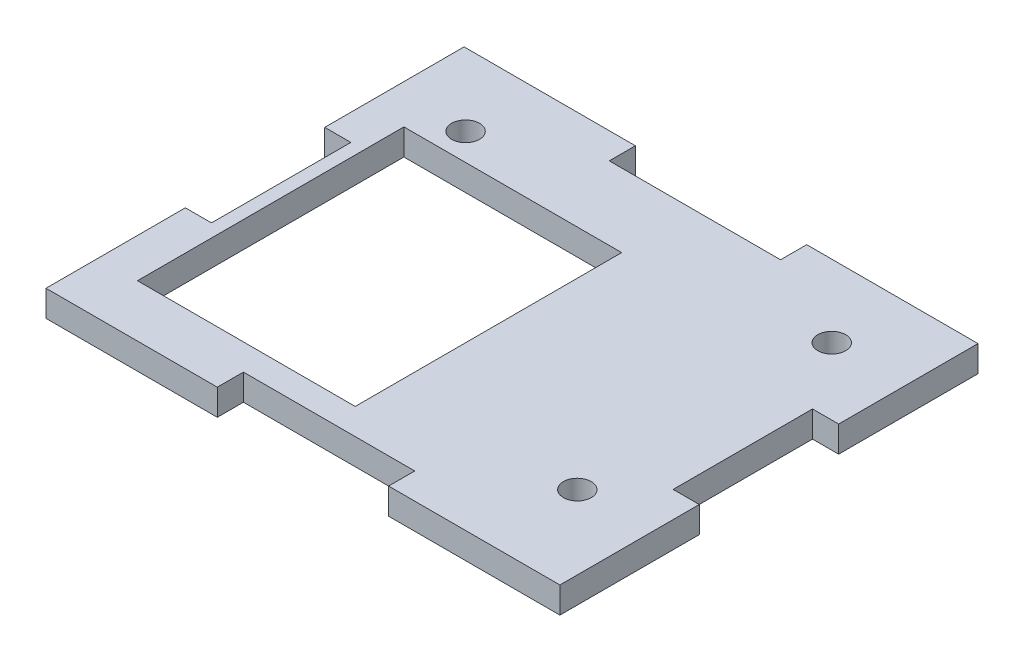
ISO-10303-21;
HEADER;
FILE_DESCRIPTION(('STEP AP214'),'2;1');
FILE_NAME('part.step','',(''),(''),'','','');
FILE_SCHEMA(('AUTOMOTIVE_DESIGN { 1 0 10303 214 1 1 1 1 }'));
ENDSEC;
DATA;
#1=APPLICATION_CONTEXT('core data for automotive mechanical design processes');
#2=APPLICATION_PROTOCOL_DEFINITION('international standard','automotive_design',2000,#1);
#3=PRODUCT_CONTEXT('',#1,'mechanical');
#4=PRODUCT('Part','Part','',(#3));
#5=PRODUCT_RELATED_PRODUCT_CATEGORY('part','',(#4));
#6=PRODUCT_DEFINITION_FORMATION('','',#4);
#7=PRODUCT_DEFINITION_CONTEXT('part definition',#1,'design');
#8=PRODUCT_DEFINITION('design','',#6,#7);
#9=PRODUCT_DEFINITION_SHAPE('','',#8);
#10=(LENGTH_UNIT() NAMED_UNIT(*) SI_UNIT(.MILLI.,.METRE.));
#11=(NAMED_UNIT(*) PLANE_ANGLE_UNIT() SI_UNIT($,.RADIAN.));
#12=(NAMED_UNIT(*) SI_UNIT($,.STERADIAN.) SOLID_ANGLE_UNIT());
#13=UNCERTAINTY_MEASURE_WITH_UNIT(LENGTH_MEASURE(1.E-05),#10,'distance_accuracy_value','');
#14=(GEOMETRIC_REPRESENTATION_CONTEXT(3) GLOBAL_UNCERTAINTY_ASSIGNED_CONTEXT((#13)) GLOBAL_UNIT_ASSIGNED_CONTEXT((#10,
#11,#12)) REPRESENTATION_CONTEXT('',''));
#15=CARTESIAN_POINT('',(0.,0.,0.));
#16=DIRECTION('',(0.,0.,1.));
#17=DIRECTION('',(1.,0.,0.));
#18=AXIS2_PLACEMENT_3D('',#15,#16,#17);
#19=CARTESIAN_POINT('',(0.,3.,0.));
#20=DIRECTION('',(0.,1.,0.));
#21=DIRECTION('',(0.,0.,1.));
#22=AXIS2_PLACEMENT_3D('',#19,#20,#21);
#23=PLANE('',#22);
#24=DIRECTION('',(0.,0.,-1.));
#25=VECTOR('',#24,1.);
#26=CARTESIAN_POINT('',(0.,3.,18.));
#27=LINE('',#26,#25);
#28=CARTESIAN_POINT('',(0.,3.,18.));
#29=VERTEX_POINT('',#28);
#30=CARTESIAN_POINT('',(0.,3.,-12.59));
#31=VERTEX_POINT('',#30);
#32=EDGE_CURVE('E48',#29,#31,#27,.T.);
#33=ORIENTED_EDGE('',*,*,#32,.F.);
#34=DIRECTION('',(1.,0.,0.));
#35=VECTOR('',#34,1.);
#36=CARTESIAN_POINT('',(-25.,3.,18.));
#37=LINE('',#36,#35);
#38=CARTESIAN_POINT('',(-25.,3.,18.));
#39=VERTEX_POINT('',#38);
#40=EDGE_CURVE('E212',#39,#29,#37,.T.);
#41=ORIENTED_EDGE('',*,*,#40,.F.);
#42=DIRECTION('',(0.,0.,1.));
#43=VECTOR('',#42,1.);
#44=CARTESIAN_POINT('',(-25.,3.,18.));
#45=LINE('',#44,#43);
#46=CARTESIAN_POINT('',(-25.,3.,-12.59));
#47=VERTEX_POINT('',#46);
#48=EDGE_CURVE('E215',#47,#39,#45,.T.);
#49=ORIENTED_EDGE('',*,*,#48,.F.);
#50=DIRECTION('',(-1.,0.,0.));
#51=VECTOR('',#50,1.);
#52=CARTESIAN_POINT('',(-25.,3.,-12.59));
#53=LINE('',#52,#51);
#54=EDGE_CURVE('E221',#31,#47,#53,.T.);
#55=ORIENTED_EDGE('',*,*,#54,.F.);
#56=EDGE_LOOP('',(#33,#41,#49,#55));
#57=FACE_BOUND('',#56,.T.);
#58=CARTESIAN_POINT('',(21.0185,3.,-15.69));
#59=DIRECTION('',(0.,1.,0.));
#60=DIRECTION('',(0.,0.,1.));
#61=AXIS2_PLACEMENT_3D('',#58,#59,#60);
#62=CIRCLE('',#61,1.6);
#63=CARTESIAN_POINT('',(21.0185,3.,-14.09));
#64=VERTEX_POINT('',#63);
#65=EDGE_CURVE('E237',#64,#64,#62,.T.);
#66=ORIENTED_EDGE('',*,*,#65,.F.);
#67=EDGE_LOOP('',(#66));
#68=FACE_BOUND('',#67,.T.);
#69=DIRECTION('',(-1.,0.,0.));
#70=VECTOR('',#69,1.);
#71=CARTESIAN_POINT('',(-9.83333333333333,3.,-24.));
#72=LINE('',#71,#70);
#73=CARTESIAN_POINT('',(-9.83333333333333,3.,-24.));
#74=VERTEX_POINT('',#73);
#75=CARTESIAN_POINT('',(-29.5,3.,-24.));
#76=VERTEX_POINT('',#75);
#77=EDGE_CURVE('E249',#74,#76,#72,.T.);
#78=ORIENTED_EDGE('',*,*,#77,.T.);
#79=DIRECTION('',(0.,0.,1.));
#80=VECTOR('',#79,1.);
#81=CARTESIAN_POINT('',(-29.5,3.,-24.));
#82=LINE('',#81,#80);
#83=CARTESIAN_POINT('',(-29.5,3.,-8.));
#84=VERTEX_POINT('',#83);
#85=EDGE_CURVE('E252',#76,#84,#82,.T.);
#86=ORIENTED_EDGE('',*,*,#85,.T.);
#87=DIRECTION('',(1.,0.,0.));
#88=VECTOR('',#87,1.);
#89=CARTESIAN_POINT('',(-29.5,3.,-8.));
#90=LINE('',#89,#88);
#91=CARTESIAN_POINT('',(-26.5,3.,-8.));
#92=VERTEX_POINT('',#91);
#93=EDGE_CURVE('E255',#84,#92,#90,.T.);
#94=ORIENTED_EDGE('',*,*,#93,.T.);
#95=DIRECTION('',(0.,0.,1.));
#96=VECTOR('',#95,1.);
#97=CARTESIAN_POINT('',(-26.5,3.,-8.));
#98=LINE('',#97,#96);
#99=CARTESIAN_POINT('',(-26.5,3.,8.));
#100=VERTEX_POINT('',#99);
#101=EDGE_CURVE('E257',#92,#100,#98,.T.);
#102=ORIENTED_EDGE('',*,*,#101,.T.);
#103=DIRECTION('',(-1.,0.,0.));
#104=VECTOR('',#103,1.);
#105=CARTESIAN_POINT('',(-26.5,3.,8.));
#106=LINE('',#105,#104);
#107=CARTESIAN_POINT('',(-29.5,3.,8.));
#108=VERTEX_POINT('',#107);
#109=EDGE_CURVE('E259',#100,#108,#106,.T.);
#110=ORIENTED_EDGE('',*,*,#109,.T.);
#111=DIRECTION('',(0.,0.,1.));
#112=VECTOR('',#111,1.);
#113=CARTESIAN_POINT('',(-29.5,3.,8.));
#114=LINE('',#113,#112);
#115=CARTESIAN_POINT('',(-29.5,3.,24.));
#116=VERTEX_POINT('',#115);
#117=EDGE_CURVE('E261',#108,#116,#114,.T.);
#118=ORIENTED_EDGE('',*,*,#117,.T.);
#119=DIRECTION('',(1.,0.,0.));
#120=VECTOR('',#119,1.);
#121=CARTESIAN_POINT('',(-29.5,3.,24.));
#122=LINE('',#121,#120);
#123=CARTESIAN_POINT('',(-9.83333333333333,3.,24.));
#124=VERTEX_POINT('',#123);
#125=EDGE_CURVE('E263',#116,#124,#122,.T.);
#126=ORIENTED_EDGE('',*,*,#125,.T.);
#127=DIRECTION('',(0.,0.,-1.));
#128=VECTOR('',#127,1.);
#129=CARTESIAN_POINT('',(-9.83333333333333,3.,24.));
#130=LINE('',#129,#128);
#131=CARTESIAN_POINT('',(-9.83333333333333,3.,21.));
#132=VERTEX_POINT('',#131);
#133=EDGE_CURVE('E265',#124,#132,#130,.T.);
#134=ORIENTED_EDGE('',*,*,#133,.T.);
#135=DIRECTION('',(1.,0.,0.));
#136=VECTOR('',#135,1.);
#137=CARTESIAN_POINT('',(-9.83333333333333,3.,21.));
#138=LINE('',#137,#136);
#139=CARTESIAN_POINT('',(9.83333333333333,3.,21.));
#140=VERTEX_POINT('',#139);
#141=EDGE_CURVE('E267',#132,#140,#138,.T.);
#142=ORIENTED_EDGE('',*,*,#141,.T.);
#143=DIRECTION('',(0.,0.,1.));
#144=VECTOR('',#143,1.);
#145=CARTESIAN_POINT('',(9.83333333333333,3.,21.));
#146=LINE('',#145,#144);
#147=CARTESIAN_POINT('',(9.83333333333333,3.,24.));
#148=VERTEX_POINT('',#147);
#149=EDGE_CURVE('E269',#140,#148,#146,.T.);
#150=ORIENTED_EDGE('',*,*,#149,.T.);
#151=DIRECTION('',(1.,0.,0.));
#152=VECTOR('',#151,1.);
#153=CARTESIAN_POINT('',(9.83333333333333,3.,24.));
#154=LINE('',#153,#152);
#155=CARTESIAN_POINT('',(29.5,3.,24.));
#156=VERTEX_POINT('',#155);
#157=EDGE_CURVE('E271',#148,#156,#154,.T.);
#158=ORIENTED_EDGE('',*,*,#157,.T.);
#159=DIRECTION('',(0.,0.,-1.));
#160=VECTOR('',#159,1.);
#161=CARTESIAN_POINT('',(29.5,3.,24.));
#162=LINE('',#161,#160);
#163=CARTESIAN_POINT('',(29.5,3.,8.));
#164=VERTEX_POINT('',#163);
#165=EDGE_CURVE('E273',#156,#164,#162,.T.);
#166=ORIENTED_EDGE('',*,*,#165,.T.);
#167=DIRECTION('',(-1.,0.,0.));
#168=VECTOR('',#167,1.);
#169=CARTESIAN_POINT('',(29.5,3.,8.));
#170=LINE('',#169,#168);
#171=CARTESIAN_POINT('',(26.5,3.,8.));
#172=VERTEX_POINT('',#171);
#173=EDGE_CURVE('E275',#164,#172,#170,.T.);
#174=ORIENTED_EDGE('',*,*,#173,.T.);
#175=DIRECTION('',(0.,0.,-1.));
#176=VECTOR('',#175,1.);
#177=CARTESIAN_POINT('',(26.5,3.,8.));
#178=LINE('',#177,#176);
#179=CARTESIAN_POINT('',(26.5,3.,-7.99999999999999));
#180=VERTEX_POINT('',#179);
#181=EDGE_CURVE('E277',#172,#180,#178,.T.);
#182=ORIENTED_EDGE('',*,*,#181,.T.);
#183=DIRECTION('',(1.,0.,0.));
#184=VECTOR('',#183,1.);
#185=CARTESIAN_POINT('',(26.5,3.,-7.99999999999999));
#186=LINE('',#185,#184);
#187=CARTESIAN_POINT('',(29.5,3.,-7.99999999999999));
#188=VERTEX_POINT('',#187);
#189=EDGE_CURVE('E279',#180,#188,#186,.T.);
#190=ORIENTED_EDGE('',*,*,#189,.T.);
#191=DIRECTION('',(0.,0.,-1.));
#192=VECTOR('',#191,1.);
#193=CARTESIAN_POINT('',(29.5,3.,-7.99999999999999));
#194=LINE('',#193,#192);
#195=CARTESIAN_POINT('',(29.5,3.,-24.));
#196=VERTEX_POINT('',#195);
#197=EDGE_CURVE('E281',#188,#196,#194,.T.);
#198=ORIENTED_EDGE('',*,*,#197,.T.);
#199=DIRECTION('',(-1.,0.,0.));
#200=VECTOR('',#199,1.);
#201=CARTESIAN_POINT('',(29.5,3.,-24.));
#202=LINE('',#201,#200);
#203=CARTESIAN_POINT('',(9.83333333333334,3.,-24.));
#204=VERTEX_POINT('',#203);
#205=EDGE_CURVE('E283',#196,#204,#202,.T.);
#206=ORIENTED_EDGE('',*,*,#205,.T.);
#207=DIRECTION('',(0.,0.,1.));
#208=VECTOR('',#207,1.);
#209=CARTESIAN_POINT('',(9.83333333333334,3.,-24.));
#210=LINE('',#209,#208);
#211=CARTESIAN_POINT('',(9.83333333333334,3.,-21.));
#212=VERTEX_POINT('',#211);
#213=EDGE_CURVE('E285',#204,#212,#210,.T.);
#214=ORIENTED_EDGE('',*,*,#213,.T.);
#215=DIRECTION('',(-1.,0.,0.));
#216=VECTOR('',#215,1.);
#217=CARTESIAN_POINT('',(9.83333333333334,3.,-21.));
#218=LINE('',#217,#216);
#219=CARTESIAN_POINT('',(-9.83333333333333,3.,-21.));
#220=VERTEX_POINT('',#219);
#221=EDGE_CURVE('E287',#212,#220,#218,.T.);
#222=ORIENTED_EDGE('',*,*,#221,.T.);
#223=DIRECTION('',(0.,0.,-1.));
#224=VECTOR('',#223,1.);
#225=CARTESIAN_POINT('',(-9.83333333333333,3.,-21.));
#226=LINE('',#225,#224);
#227=EDGE_CURVE('E289',#220,#74,#226,.T.);
#228=ORIENTED_EDGE('',*,*,#227,.T.);
#229=EDGE_LOOP('',(#78,#86,#94,#102,#110,#118,#126,#134,#142,#150,#158,#166,#174,#182,#190,#198,
#206,#214,#222,#228));
#230=FACE_BOUND('',#229,.T.);
#231=CARTESIAN_POINT('',(-21.0185,3.,-15.69));
#232=DIRECTION('',(0.,1.,0.));
#233=DIRECTION('',(0.,0.,1.));
#234=AXIS2_PLACEMENT_3D('',#231,#232,#233);
#235=CIRCLE('',#234,1.6);
#236=CARTESIAN_POINT('',(-21.0185,3.,-14.09));
#237=VERTEX_POINT('',#236);
#238=EDGE_CURVE('E243',#237,#237,#235,.T.);
#239=ORIENTED_EDGE('',*,*,#238,.F.);
#240=EDGE_LOOP('',(#239));
#241=FACE_BOUND('',#240,.T.);
#242=CARTESIAN_POINT('',(21.0185,3.,13.52));
#243=DIRECTION('',(0.,1.,0.));
#244=DIRECTION('',(0.,0.,1.));
#245=AXIS2_PLACEMENT_3D('',#242,#243,#244);
#246=CIRCLE('',#245,1.6);
#247=CARTESIAN_POINT('',(21.0185,3.,15.12));
#248=VERTEX_POINT('',#247);
#249=EDGE_CURVE('E231',#248,#248,#246,.T.);
#250=ORIENTED_EDGE('',*,*,#249,.F.);
#251=EDGE_LOOP('',(#250));
#252=FACE_BOUND('',#251,.T.);
#253=ADVANCED_FACE('F33',(#57,#68,#230,#241,#252),#23,.T.);
#254=CARTESIAN_POINT('',(0.,0.,0.));
#255=DIRECTION('',(0.,1.,0.));
#256=DIRECTION('',(0.,0.,1.));
#257=AXIS2_PLACEMENT_3D('',#254,#255,#256);
#258=PLANE('',#257);
#259=DIRECTION('',(1.,0.,0.));
#260=VECTOR('',#259,1.);
#261=CARTESIAN_POINT('',(-25.,0.,18.));
#262=LINE('',#261,#260);
#263=CARTESIAN_POINT('',(-25.,0.,18.));
#264=VERTEX_POINT('',#263);
#265=CARTESIAN_POINT('',(0.,0.,18.));
#266=VERTEX_POINT('',#265);
#267=EDGE_CURVE('E202',#264,#266,#262,.T.);
#268=ORIENTED_EDGE('',*,*,#267,.T.);
#269=DIRECTION('',(0.,0.,-1.));
#270=VECTOR('',#269,1.);
#271=CARTESIAN_POINT('',(0.,0.,18.));
#272=LINE('',#271,#270);
#273=CARTESIAN_POINT('',(0.,0.,-12.59));
#274=VERTEX_POINT('',#273);
#275=EDGE_CURVE('E196',#266,#274,#272,.T.);
#276=ORIENTED_EDGE('',*,*,#275,.T.);
#277=DIRECTION('',(-1.,0.,0.));
#278=VECTOR('',#277,1.);
#279=CARTESIAN_POINT('',(-25.,0.,-12.59));
#280=LINE('',#279,#278);
#281=CARTESIAN_POINT('',(-25.,0.,-12.59));
#282=VERTEX_POINT('',#281);
#283=EDGE_CURVE('E205',#274,#282,#280,.T.);
#284=ORIENTED_EDGE('',*,*,#283,.T.);
#285=DIRECTION('',(0.,0.,1.));
#286=VECTOR('',#285,1.);
#287=CARTESIAN_POINT('',(-25.,0.,18.));
#288=LINE('',#287,#286);
#289=EDGE_CURVE('E56',#282,#264,#288,.T.);
#290=ORIENTED_EDGE('',*,*,#289,.T.);
#291=EDGE_LOOP('',(#268,#276,#284,#290));
#292=FACE_BOUND('',#291,.T.);
#293=DIRECTION('',(-1.,0.,0.));
#294=VECTOR('',#293,1.);
#295=CARTESIAN_POINT('',(-9.83333333333333,0.,-24.));
#296=LINE('',#295,#294);
#297=CARTESIAN_POINT('',(-9.83333333333333,0.,-24.));
#298=VERTEX_POINT('',#297);
#299=CARTESIAN_POINT('',(-29.5,0.,-24.));
#300=VERTEX_POINT('',#299);
#301=EDGE_CURVE('E246',#298,#300,#296,.T.);
#302=ORIENTED_EDGE('',*,*,#301,.F.);
#303=DIRECTION('',(0.,0.,-1.));
#304=VECTOR('',#303,1.);
#305=CARTESIAN_POINT('',(-9.83333333333333,0.,-21.));
#306=LINE('',#305,#304);
#307=CARTESIAN_POINT('',(-9.83333333333333,0.,-21.));
#308=VERTEX_POINT('',#307);
#309=EDGE_CURVE('E253',#308,#298,#306,.T.);
#310=ORIENTED_EDGE('',*,*,#309,.F.);
#311=DIRECTION('',(-1.,0.,0.));
#312=VECTOR('',#311,1.);
#313=CARTESIAN_POINT('',(9.83333333333334,0.,-21.));
#314=LINE('',#313,#312);
#315=CARTESIAN_POINT('',(9.83333333333334,0.,-21.));
#316=VERTEX_POINT('',#315);
#317=EDGE_CURVE('E328',#316,#308,#314,.T.);
#318=ORIENTED_EDGE('',*,*,#317,.F.);
#319=DIRECTION('',(0.,0.,1.));
#320=VECTOR('',#319,1.);
#321=CARTESIAN_POINT('',(9.83333333333334,0.,-24.));
#322=LINE('',#321,#320);
#323=CARTESIAN_POINT('',(9.83333333333334,0.,-24.));
#324=VERTEX_POINT('',#323);
#325=EDGE_CURVE('E326',#324,#316,#322,.T.);
#326=ORIENTED_EDGE('',*,*,#325,.F.);
#327=DIRECTION('',(-1.,0.,0.));
#328=VECTOR('',#327,1.);
#329=CARTESIAN_POINT('',(29.5,0.,-24.));
#330=LINE('',#329,#328);
#331=CARTESIAN_POINT('',(29.5,0.,-24.));
#332=VERTEX_POINT('',#331);
#333=EDGE_CURVE('E324',#332,#324,#330,.T.);
#334=ORIENTED_EDGE('',*,*,#333,.F.);
#335=DIRECTION('',(0.,0.,-1.));
#336=VECTOR('',#335,1.);
#337=CARTESIAN_POINT('',(29.5,0.,-7.99999999999999));
#338=LINE('',#337,#336);
#339=CARTESIAN_POINT('',(29.5,0.,-7.99999999999999));
#340=VERTEX_POINT('',#339);
#341=EDGE_CURVE('E322',#340,#332,#338,.T.);
#342=ORIENTED_EDGE('',*,*,#341,.F.);
#343=DIRECTION('',(1.,0.,0.));
#344=VECTOR('',#343,1.);
#345=CARTESIAN_POINT('',(26.5,0.,-7.99999999999999));
#346=LINE('',#345,#344);
#347=CARTESIAN_POINT('',(26.5,0.,-7.99999999999999));
#348=VERTEX_POINT('',#347);
#349=EDGE_CURVE('E320',#348,#340,#346,.T.);
#350=ORIENTED_EDGE('',*,*,#349,.F.);
#351=DIRECTION('',(0.,0.,-1.));
#352=VECTOR('',#351,1.);
#353=CARTESIAN_POINT('',(26.5,0.,8.));
#354=LINE('',#353,#352);
#355=CARTESIAN_POINT('',(26.5,0.,8.));
#356=VERTEX_POINT('',#355);
#357=EDGE_CURVE('E318',#356,#348,#354,.T.);
#358=ORIENTED_EDGE('',*,*,#357,.F.);
#359=DIRECTION('',(-1.,0.,0.));
#360=VECTOR('',#359,1.);
#361=CARTESIAN_POINT('',(29.5,0.,8.));
#362=LINE('',#361,#360);
#363=CARTESIAN_POINT('',(29.5,0.,8.));
#364=VERTEX_POINT('',#363);
#365=EDGE_CURVE('E316',#364,#356,#362,.T.);
#366=ORIENTED_EDGE('',*,*,#365,.F.);
#367=DIRECTION('',(0.,0.,-1.));
#368=VECTOR('',#367,1.);
#369=CARTESIAN_POINT('',(29.5,0.,24.));
#370=LINE('',#369,#368);
#371=CARTESIAN_POINT('',(29.5,0.,24.));
#372=VERTEX_POINT('',#371);
#373=EDGE_CURVE('E314',#372,#364,#370,.T.);
#374=ORIENTED_EDGE('',*,*,#373,.F.);
#375=DIRECTION('',(1.,0.,0.));
#376=VECTOR('',#375,1.);
#377=CARTESIAN_POINT('',(9.83333333333333,0.,24.));
#378=LINE('',#377,#376);
#379=CARTESIAN_POINT('',(9.83333333333333,0.,24.));
#380=VERTEX_POINT('',#379);
#381=EDGE_CURVE('E312',#380,#372,#378,.T.);
#382=ORIENTED_EDGE('',*,*,#381,.F.);
#383=DIRECTION('',(0.,0.,1.));
#384=VECTOR('',#383,1.);
#385=CARTESIAN_POINT('',(9.83333333333333,0.,21.));
#386=LINE('',#385,#384);
#387=CARTESIAN_POINT('',(9.83333333333333,0.,21.));
#388=VERTEX_POINT('',#387);
#389=EDGE_CURVE('E310',#388,#380,#386,.T.);
#390=ORIENTED_EDGE('',*,*,#389,.F.);
#391=DIRECTION('',(1.,0.,0.));
#392=VECTOR('',#391,1.);
#393=CARTESIAN_POINT('',(-9.83333333333333,0.,21.));
#394=LINE('',#393,#392);
#395=CARTESIAN_POINT('',(-9.83333333333333,0.,21.));
#396=VERTEX_POINT('',#395);
#397=EDGE_CURVE('E308',#396,#388,#394,.T.);
#398=ORIENTED_EDGE('',*,*,#397,.F.);
#399=DIRECTION('',(0.,0.,-1.));
#400=VECTOR('',#399,1.);
#401=CARTESIAN_POINT('',(-9.83333333333333,0.,24.));
#402=LINE('',#401,#400);
#403=CARTESIAN_POINT('',(-9.83333333333333,0.,24.));
#404=VERTEX_POINT('',#403);
#405=EDGE_CURVE('E306',#404,#396,#402,.T.);
#406=ORIENTED_EDGE('',*,*,#405,.F.);
#407=DIRECTION('',(1.,0.,0.));
#408=VECTOR('',#407,1.);
#409=CARTESIAN_POINT('',(-29.5,0.,24.));
#410=LINE('',#409,#408);
#411=CARTESIAN_POINT('',(-29.5,0.,24.));
#412=VERTEX_POINT('',#411);
#413=EDGE_CURVE('E304',#412,#404,#410,.T.);
#414=ORIENTED_EDGE('',*,*,#413,.F.);
#415=DIRECTION('',(0.,0.,1.));
#416=VECTOR('',#415,1.);
#417=CARTESIAN_POINT('',(-29.5,0.,8.));
#418=LINE('',#417,#416);
#419=CARTESIAN_POINT('',(-29.5,0.,8.));
#420=VERTEX_POINT('',#419);
#421=EDGE_CURVE('E302',#420,#412,#418,.T.);
#422=ORIENTED_EDGE('',*,*,#421,.F.);
#423=DIRECTION('',(-1.,0.,0.));
#424=VECTOR('',#423,1.);
#425=CARTESIAN_POINT('',(-26.5,0.,8.));
#426=LINE('',#425,#424);
#427=CARTESIAN_POINT('',(-26.5,0.,8.));
#428=VERTEX_POINT('',#427);
#429=EDGE_CURVE('E300',#428,#420,#426,.T.);
#430=ORIENTED_EDGE('',*,*,#429,.F.);
#431=DIRECTION('',(0.,0.,1.));
#432=VECTOR('',#431,1.);
#433=CARTESIAN_POINT('',(-26.5,0.,-8.));
#434=LINE('',#433,#432);
#435=CARTESIAN_POINT('',(-26.5,0.,-8.));
#436=VERTEX_POINT('',#435);
#437=EDGE_CURVE('E298',#436,#428,#434,.T.);
#438=ORIENTED_EDGE('',*,*,#437,.F.);
#439=DIRECTION('',(1.,0.,0.));
#440=VECTOR('',#439,1.);
#441=CARTESIAN_POINT('',(-29.5,0.,-8.));
#442=LINE('',#441,#440);
#443=CARTESIAN_POINT('',(-29.5,0.,-8.));
#444=VERTEX_POINT('',#443);
#445=EDGE_CURVE('E296',#444,#436,#442,.T.);
#446=ORIENTED_EDGE('',*,*,#445,.F.);
#447=DIRECTION('',(0.,0.,1.));
#448=VECTOR('',#447,1.);
#449=CARTESIAN_POINT('',(-29.5,0.,-24.));
#450=LINE('',#449,#448);
#451=EDGE_CURVE('E294',#300,#444,#450,.T.);
#452=ORIENTED_EDGE('',*,*,#451,.F.);
#453=EDGE_LOOP('',(#302,#310,#318,#326,#334,#342,#350,#358,#366,#374,#382,#390,#398,#406,#414,
#422,#430,#438,#446,#452));
#454=FACE_BOUND('',#453,.T.);
#455=CARTESIAN_POINT('',(-21.0185,0.,-15.69));
#456=DIRECTION('',(0.,1.,0.));
#457=DIRECTION('',(0.,0.,1.));
#458=AXIS2_PLACEMENT_3D('',#455,#456,#457);
#459=CIRCLE('',#458,1.6);
#460=CARTESIAN_POINT('',(-21.0185,0.,-14.09));
#461=VERTEX_POINT('',#460);
#462=EDGE_CURVE('E240',#461,#461,#459,.T.);
#463=ORIENTED_EDGE('',*,*,#462,.T.);
#464=EDGE_LOOP('',(#463));
#465=FACE_BOUND('',#464,.T.);
#466=CARTESIAN_POINT('',(21.0185,0.,-15.69));
#467=DIRECTION('',(0.,1.,0.));
#468=DIRECTION('',(0.,0.,1.));
#469=AXIS2_PLACEMENT_3D('',#466,#467,#468);
#470=CIRCLE('',#469,1.6);
#471=CARTESIAN_POINT('',(21.0185,0.,-14.09));
#472=VERTEX_POINT('',#471);
#473=EDGE_CURVE('E234',#472,#472,#470,.T.);
#474=ORIENTED_EDGE('',*,*,#473,.T.);
#475=EDGE_LOOP('',(#474));
#476=FACE_BOUND('',#475,.T.);
#477=CARTESIAN_POINT('',(21.0185,0.,13.52));
#478=DIRECTION('',(0.,1.,0.));
#479=DIRECTION('',(0.,0.,1.));
#480=AXIS2_PLACEMENT_3D('',#477,#478,#479);
#481=CIRCLE('',#480,1.6);
#482=CARTESIAN_POINT('',(21.0185,0.,15.12));
#483=VERTEX_POINT('',#482);
#484=EDGE_CURVE('E227',#483,#483,#481,.T.);
#485=ORIENTED_EDGE('',*,*,#484,.T.);
#486=EDGE_LOOP('',(#485));
#487=FACE_BOUND('',#486,.T.);
#488=ADVANCED_FACE('F209',(#292,#454,#465,#476,#487),#258,.F.);
#489=CARTESIAN_POINT('',(-9.83333333333333,3.,-24.));
#490=DIRECTION('',(0.,0.,1.));
#491=DIRECTION('',(1.,0.,0.));
#492=AXIS2_PLACEMENT_3D('',#489,#490,#491);
#493=PLANE('',#492);
#494=ORIENTED_EDGE('',*,*,#301,.T.);
#495=DIRECTION('',(0.,-1.,0.));
#496=VECTOR('',#495,1.);
#497=CARTESIAN_POINT('',(-29.5,3.,-24.));
#498=LINE('',#497,#496);
#499=EDGE_CURVE('E11',#76,#300,#498,.T.);
#500=ORIENTED_EDGE('',*,*,#499,.F.);
#501=ORIENTED_EDGE('',*,*,#77,.F.);
#502=DIRECTION('',(0.,-1.,0.));
#503=VECTOR('',#502,1.);
#504=CARTESIAN_POINT('',(-9.83333333333333,3.,-24.));
#505=LINE('',#504,#503);
#506=EDGE_CURVE('E291',#74,#298,#505,.T.);
#507=ORIENTED_EDGE('',*,*,#506,.T.);
#508=EDGE_LOOP('',(#494,#500,#501,#507));
#509=FACE_BOUND('',#508,.T.);
#510=ADVANCED_FACE('F35',(#509),#493,.F.);
#511=CARTESIAN_POINT('',(-29.5,3.,-24.));
#512=DIRECTION('',(1.,0.,0.));
#513=DIRECTION('',(0.,0.,-1.));
#514=AXIS2_PLACEMENT_3D('',#511,#512,#513);
#515=PLANE('',#514);
#516=ORIENTED_EDGE('',*,*,#451,.T.);
#517=DIRECTION('',(0.,-1.,0.));
#518=VECTOR('',#517,1.);
#519=CARTESIAN_POINT('',(-29.5,3.,-8.));
#520=LINE('',#519,#518);
#521=EDGE_CURVE('E41',#84,#444,#520,.T.);
#522=ORIENTED_EDGE('',*,*,#521,.F.);
#523=ORIENTED_EDGE('',*,*,#85,.F.);
#524=ORIENTED_EDGE('',*,*,#499,.T.);
#525=EDGE_LOOP('',(#516,#522,#523,#524));
#526=FACE_BOUND('',#525,.T.);
#527=ADVANCED_FACE('F410',(#526),#515,.F.);
#528=CARTESIAN_POINT('',(-29.5,3.,-8.));
#529=DIRECTION('',(0.,0.,-1.));
#530=DIRECTION('',(-1.,0.,0.));
#531=AXIS2_PLACEMENT_3D('',#528,#529,#530);
#532=PLANE('',#531);
#533=ORIENTED_EDGE('',*,*,#445,.T.);
#534=DIRECTION('',(0.,-1.,0.));
#535=VECTOR('',#534,1.);
#536=CARTESIAN_POINT('',(-26.5,3.,-8.));
#537=LINE('',#536,#535);
#538=EDGE_CURVE('E381',#92,#436,#537,.T.);
#539=ORIENTED_EDGE('',*,*,#538,.F.);
#540=ORIENTED_EDGE('',*,*,#93,.F.);
#541=ORIENTED_EDGE('',*,*,#521,.T.);
#542=EDGE_LOOP('',(#533,#539,#540,#541));
#543=FACE_BOUND('',#542,.T.);
#544=ADVANCED_FACE('F388',(#543),#532,.F.);
#545=CARTESIAN_POINT('',(-26.5,3.,-8.));
#546=DIRECTION('',(1.,0.,0.));
#547=DIRECTION('',(0.,0.,-1.));
#548=AXIS2_PLACEMENT_3D('',#545,#546,#547);
#549=PLANE('',#548);
#550=ORIENTED_EDGE('',*,*,#437,.T.);
#551=DIRECTION('',(0.,-1.,0.));
#552=VECTOR('',#551,1.);
#553=CARTESIAN_POINT('',(-26.5,3.,8.));
#554=LINE('',#553,#552);
#555=EDGE_CURVE('E378',#100,#428,#554,.T.);
#556=ORIENTED_EDGE('',*,*,#555,.F.);
#557=ORIENTED_EDGE('',*,*,#101,.F.);
#558=ORIENTED_EDGE('',*,*,#538,.T.);
#559=EDGE_LOOP('',(#550,#556,#557,#558));
#560=FACE_BOUND('',#559,.T.);
#561=ADVANCED_FACE('F398',(#560),#549,.F.);
#562=CARTESIAN_POINT('',(-26.5,3.,8.));
#563=DIRECTION('',(0.,0.,1.));
#564=DIRECTION('',(1.,0.,0.));
#565=AXIS2_PLACEMENT_3D('',#562,#563,#564);
#566=PLANE('',#565);
#567=ORIENTED_EDGE('',*,*,#429,.T.);
#568=DIRECTION('',(0.,-1.,0.));
#569=VECTOR('',#568,1.);
#570=CARTESIAN_POINT('',(-29.5,3.,8.));
#571=LINE('',#570,#569);
#572=EDGE_CURVE('E375',#108,#420,#571,.T.);
#573=ORIENTED_EDGE('',*,*,#572,.F.);
#574=ORIENTED_EDGE('',*,*,#109,.F.);
#575=ORIENTED_EDGE('',*,*,#555,.T.);
#576=EDGE_LOOP('',(#567,#573,#574,#575));
#577=FACE_BOUND('',#576,.T.);
#578=ADVANCED_FACE('F402',(#577),#566,.F.);
#579=CARTESIAN_POINT('',(-29.5,3.,8.));
#580=DIRECTION('',(1.,0.,0.));
#581=DIRECTION('',(0.,0.,-1.));
#582=AXIS2_PLACEMENT_3D('',#579,#580,#581);
#583=PLANE('',#582);
#584=ORIENTED_EDGE('',*,*,#421,.T.);
#585=DIRECTION('',(0.,-1.,0.));
#586=VECTOR('',#585,1.);
#587=CARTESIAN_POINT('',(-29.5,3.,24.));
#588=LINE('',#587,#586);
#589=EDGE_CURVE('E372',#116,#412,#588,.T.);
#590=ORIENTED_EDGE('',*,*,#589,.F.);
#591=ORIENTED_EDGE('',*,*,#117,.F.);
#592=ORIENTED_EDGE('',*,*,#572,.T.);
#593=EDGE_LOOP('',(#584,#590,#591,#592));
#594=FACE_BOUND('',#593,.T.);
#595=ADVANCED_FACE('F483',(#594),#583,.F.);
#596=CARTESIAN_POINT('',(-29.5,3.,24.));
#597=DIRECTION('',(0.,0.,-1.));
#598=DIRECTION('',(-1.,0.,0.));
#599=AXIS2_PLACEMENT_3D('',#596,#597,#598);
#600=PLANE('',#599);
#601=ORIENTED_EDGE('',*,*,#413,.T.);
#602=DIRECTION('',(0.,-1.,0.));
#603=VECTOR('',#602,1.);
#604=CARTESIAN_POINT('',(-9.83333333333333,3.,24.));
#605=LINE('',#604,#603);
#606=EDGE_CURVE('E369',#124,#404,#605,.T.);
#607=ORIENTED_EDGE('',*,*,#606,.F.);
#608=ORIENTED_EDGE('',*,*,#125,.F.);
#609=ORIENTED_EDGE('',*,*,#589,.T.);
#610=EDGE_LOOP('',(#601,#607,#608,#609));
#611=FACE_BOUND('',#610,.T.);
#612=ADVANCED_FACE('F481',(#611),#600,.F.);
#613=CARTESIAN_POINT('',(-9.83333333333333,3.,24.));
#614=DIRECTION('',(-1.,0.,0.));
#615=DIRECTION('',(0.,0.,1.));
#616=AXIS2_PLACEMENT_3D('',#613,#614,#615);
#617=PLANE('',#616);
#618=ORIENTED_EDGE('',*,*,#405,.T.);
#619=DIRECTION('',(0.,-1.,0.));
#620=VECTOR('',#619,1.);
#621=CARTESIAN_POINT('',(-9.83333333333333,3.,21.));
#622=LINE('',#621,#620);
#623=EDGE_CURVE('E366',#132,#396,#622,.T.);
#624=ORIENTED_EDGE('',*,*,#623,.F.);
#625=ORIENTED_EDGE('',*,*,#133,.F.);
#626=ORIENTED_EDGE('',*,*,#606,.T.);
#627=EDGE_LOOP('',(#618,#624,#625,#626));
#628=FACE_BOUND('',#627,.T.);
#629=ADVANCED_FACE('F476',(#628),#617,.F.);
#630=CARTESIAN_POINT('',(-9.83333333333333,3.,21.));
#631=DIRECTION('',(0.,0.,-1.));
#632=DIRECTION('',(-1.,0.,0.));
#633=AXIS2_PLACEMENT_3D('',#630,#631,#632);
#634=PLANE('',#633);
#635=ORIENTED_EDGE('',*,*,#397,.T.);
#636=DIRECTION('',(0.,-1.,0.));
#637=VECTOR('',#636,1.);
#638=CARTESIAN_POINT('',(9.83333333333333,3.,21.));
#639=LINE('',#638,#637);
#640=EDGE_CURVE('E363',#140,#388,#639,.T.);
#641=ORIENTED_EDGE('',*,*,#640,.F.);
#642=ORIENTED_EDGE('',*,*,#141,.F.);
#643=ORIENTED_EDGE('',*,*,#623,.T.);
#644=EDGE_LOOP('',(#635,#641,#642,#643));
#645=FACE_BOUND('',#644,.T.);
#646=ADVANCED_FACE('F471',(#645),#634,.F.);
#647=CARTESIAN_POINT('',(9.83333333333333,3.,21.));
#648=DIRECTION('',(1.,0.,0.));
#649=DIRECTION('',(0.,0.,-1.));
#650=AXIS2_PLACEMENT_3D('',#647,#648,#649);
#651=PLANE('',#650);
#652=ORIENTED_EDGE('',*,*,#389,.T.);
#653=DIRECTION('',(0.,-1.,0.));
#654=VECTOR('',#653,1.);
#655=CARTESIAN_POINT('',(9.83333333333333,3.,24.));
#656=LINE('',#655,#654);
#657=EDGE_CURVE('E360',#148,#380,#656,.T.);
#658=ORIENTED_EDGE('',*,*,#657,.F.);
#659=ORIENTED_EDGE('',*,*,#149,.F.);
#660=ORIENTED_EDGE('',*,*,#640,.T.);
#661=EDGE_LOOP('',(#652,#658,#659,#660));
#662=FACE_BOUND('',#661,.T.);
#663=ADVANCED_FACE('F467',(#662),#651,.F.);
#664=CARTESIAN_POINT('',(9.83333333333333,3.,24.));
#665=DIRECTION('',(0.,0.,-1.));
#666=DIRECTION('',(-1.,0.,0.));
#667=AXIS2_PLACEMENT_3D('',#664,#665,#666);
#668=PLANE('',#667);
#669=ORIENTED_EDGE('',*,*,#381,.T.);
#670=DIRECTION('',(0.,-1.,0.));
#671=VECTOR('',#670,1.);
#672=CARTESIAN_POINT('',(29.5,3.,24.));
#673=LINE('',#672,#671);
#674=EDGE_CURVE('E357',#156,#372,#673,.T.);
#675=ORIENTED_EDGE('',*,*,#674,.F.);
#676=ORIENTED_EDGE('',*,*,#157,.F.);
#677=ORIENTED_EDGE('',*,*,#657,.T.);
#678=EDGE_LOOP('',(#669,#675,#676,#677));
#679=FACE_BOUND('',#678,.T.);
#680=ADVANCED_FACE('F462',(#679),#668,.F.);
#681=CARTESIAN_POINT('',(29.5,3.,24.));
#682=DIRECTION('',(-1.,0.,0.));
#683=DIRECTION('',(0.,0.,1.));
#684=AXIS2_PLACEMENT_3D('',#681,#682,#683);
#685=PLANE('',#684);
#686=ORIENTED_EDGE('',*,*,#373,.T.);
#687=DIRECTION('',(0.,-1.,0.));
#688=VECTOR('',#687,1.);
#689=CARTESIAN_POINT('',(29.5,3.,8.));
#690=LINE('',#689,#688);
#691=EDGE_CURVE('E354',#164,#364,#690,.T.);
#692=ORIENTED_EDGE('',*,*,#691,.F.);
#693=ORIENTED_EDGE('',*,*,#165,.F.);
#694=ORIENTED_EDGE('',*,*,#674,.T.);
#695=EDGE_LOOP('',(#686,#692,#693,#694));
#696=FACE_BOUND('',#695,.T.);
#697=ADVANCED_FACE('F456',(#696),#685,.F.);
#698=CARTESIAN_POINT('',(29.5,3.,8.));
#699=DIRECTION('',(0.,0.,1.));
#700=DIRECTION('',(1.,0.,0.));
#701=AXIS2_PLACEMENT_3D('',#698,#699,#700);
#702=PLANE('',#701);
#703=ORIENTED_EDGE('',*,*,#365,.T.);
#704=DIRECTION('',(0.,-1.,0.));
#705=VECTOR('',#704,1.);
#706=CARTESIAN_POINT('',(26.5,3.,8.));
#707=LINE('',#706,#705);
#708=EDGE_CURVE('E351',#172,#356,#707,.T.);
#709=ORIENTED_EDGE('',*,*,#708,.F.);
#710=ORIENTED_EDGE('',*,*,#173,.F.);
#711=ORIENTED_EDGE('',*,*,#691,.T.);
#712=EDGE_LOOP('',(#703,#709,#710,#711));
#713=FACE_BOUND('',#712,.T.);
#714=ADVANCED_FACE('F452',(#713),#702,.F.);
#715=CARTESIAN_POINT('',(26.5,3.,8.));
#716=DIRECTION('',(-1.,0.,0.));
#717=DIRECTION('',(0.,0.,1.));
#718=AXIS2_PLACEMENT_3D('',#715,#716,#717);
#719=PLANE('',#718);
#720=ORIENTED_EDGE('',*,*,#357,.T.);
#721=DIRECTION('',(0.,-1.,0.));
#722=VECTOR('',#721,1.);
#723=CARTESIAN_POINT('',(26.5,3.,-7.99999999999999));
#724=LINE('',#723,#722);
#725=EDGE_CURVE('E348',#180,#348,#724,.T.);
#726=ORIENTED_EDGE('',*,*,#725,.F.);
#727=ORIENTED_EDGE('',*,*,#181,.F.);
#728=ORIENTED_EDGE('',*,*,#708,.T.);
#729=EDGE_LOOP('',(#720,#726,#727,#728));
#730=FACE_BOUND('',#729,.T.);
#731=ADVANCED_FACE('F447',(#730),#719,.F.);
#732=CARTESIAN_POINT('',(26.5,3.,-7.99999999999999));
#733=DIRECTION('',(0.,0.,-1.));
#734=DIRECTION('',(-1.,0.,0.));
#735=AXIS2_PLACEMENT_3D('',#732,#733,#734);
#736=PLANE('',#735);
#737=ORIENTED_EDGE('',*,*,#349,.T.);
#738=DIRECTION('',(0.,-1.,0.));
#739=VECTOR('',#738,1.);
#740=CARTESIAN_POINT('',(29.5,3.,-7.99999999999999));
#741=LINE('',#740,#739);
#742=EDGE_CURVE('E345',#188,#340,#741,.T.);
#743=ORIENTED_EDGE('',*,*,#742,.F.);
#744=ORIENTED_EDGE('',*,*,#189,.F.);
#745=ORIENTED_EDGE('',*,*,#725,.T.);
#746=EDGE_LOOP('',(#737,#743,#744,#745));
#747=FACE_BOUND('',#746,.T.);
#748=ADVANCED_FACE('F441',(#747),#736,.F.);
#749=CARTESIAN_POINT('',(29.5,3.,-7.99999999999999));
#750=DIRECTION('',(-1.,0.,0.));
#751=DIRECTION('',(0.,0.,1.));
#752=AXIS2_PLACEMENT_3D('',#749,#750,#751);
#753=PLANE('',#752);
#754=ORIENTED_EDGE('',*,*,#341,.T.);
#755=DIRECTION('',(0.,-1.,0.));
#756=VECTOR('',#755,1.);
#757=CARTESIAN_POINT('',(29.5,3.,-24.));
#758=LINE('',#757,#756);
#759=EDGE_CURVE('E342',#196,#332,#758,.T.);
#760=ORIENTED_EDGE('',*,*,#759,.F.);
#761=ORIENTED_EDGE('',*,*,#197,.F.);
#762=ORIENTED_EDGE('',*,*,#742,.T.);
#763=EDGE_LOOP('',(#754,#760,#761,#762));
#764=FACE_BOUND('',#763,.T.);
#765=ADVANCED_FACE('F437',(#764),#753,.F.);
#766=CARTESIAN_POINT('',(29.5,3.,-24.));
#767=DIRECTION('',(0.,0.,1.));
#768=DIRECTION('',(1.,0.,0.));
#769=AXIS2_PLACEMENT_3D('',#766,#767,#768);
#770=PLANE('',#769);
#771=ORIENTED_EDGE('',*,*,#333,.T.);
#772=DIRECTION('',(0.,-1.,0.));
#773=VECTOR('',#772,1.);
#774=CARTESIAN_POINT('',(9.83333333333334,3.,-24.));
#775=LINE('',#774,#773);
#776=EDGE_CURVE('E339',#204,#324,#775,.T.);
#777=ORIENTED_EDGE('',*,*,#776,.F.);
#778=ORIENTED_EDGE('',*,*,#205,.F.);
#779=ORIENTED_EDGE('',*,*,#759,.T.);
#780=EDGE_LOOP('',(#771,#777,#778,#779));
#781=FACE_BOUND('',#780,.T.);
#782=ADVANCED_FACE('F432',(#781),#770,.F.);
#783=CARTESIAN_POINT('',(9.83333333333334,3.,-24.));
#784=DIRECTION('',(1.,0.,0.));
#785=DIRECTION('',(0.,0.,-1.));
#786=AXIS2_PLACEMENT_3D('',#783,#784,#785);
#787=PLANE('',#786);
#788=ORIENTED_EDGE('',*,*,#325,.T.);
#789=DIRECTION('',(0.,-1.,0.));
#790=VECTOR('',#789,1.);
#791=CARTESIAN_POINT('',(9.83333333333334,3.,-21.));
#792=LINE('',#791,#790);
#793=EDGE_CURVE('E336',#212,#316,#792,.T.);
#794=ORIENTED_EDGE('',*,*,#793,.F.);
#795=ORIENTED_EDGE('',*,*,#213,.F.);
#796=ORIENTED_EDGE('',*,*,#776,.T.);
#797=EDGE_LOOP('',(#788,#794,#795,#796));
#798=FACE_BOUND('',#797,.T.);
#799=ADVANCED_FACE('F426',(#798),#787,.F.);
#800=CARTESIAN_POINT('',(9.83333333333334,3.,-21.));
#801=DIRECTION('',(0.,0.,1.));
#802=DIRECTION('',(1.,0.,0.));
#803=AXIS2_PLACEMENT_3D('',#800,#801,#802);
#804=PLANE('',#803);
#805=ORIENTED_EDGE('',*,*,#317,.T.);
#806=DIRECTION('',(0.,-1.,0.));
#807=VECTOR('',#806,1.);
#808=CARTESIAN_POINT('',(-9.83333333333333,3.,-21.));
#809=LINE('',#808,#807);
#810=EDGE_CURVE('E333',#220,#308,#809,.T.);
#811=ORIENTED_EDGE('',*,*,#810,.F.);
#812=ORIENTED_EDGE('',*,*,#221,.F.);
#813=ORIENTED_EDGE('',*,*,#793,.T.);
#814=EDGE_LOOP('',(#805,#811,#812,#813));
#815=FACE_BOUND('',#814,.T.);
#816=ADVANCED_FACE('F422',(#815),#804,.F.);
#817=CARTESIAN_POINT('',(-9.83333333333333,3.,-21.));
#818=DIRECTION('',(-1.,0.,0.));
#819=DIRECTION('',(0.,0.,1.));
#820=AXIS2_PLACEMENT_3D('',#817,#818,#819);
#821=PLANE('',#820);
#822=ORIENTED_EDGE('',*,*,#309,.T.);
#823=ORIENTED_EDGE('',*,*,#506,.F.);
#824=ORIENTED_EDGE('',*,*,#227,.F.);
#825=ORIENTED_EDGE('',*,*,#810,.T.);
#826=EDGE_LOOP('',(#822,#823,#824,#825));
#827=FACE_BOUND('',#826,.T.);
#828=ADVANCED_FACE('F417',(#827),#821,.F.);
#829=CARTESIAN_POINT('',(-21.0185,3.,-15.69));
#830=DIRECTION('',(0.,-1.,0.));
#831=DIRECTION('',(0.,0.,-1.));
#832=AXIS2_PLACEMENT_3D('',#829,#830,#831);
#833=CYLINDRICAL_SURFACE('',#832,1.6);
#834=ORIENTED_EDGE('',*,*,#238,.T.);
#835=EDGE_LOOP('',(#834));
#836=FACE_BOUND('',#835,.T.);
#837=ORIENTED_EDGE('',*,*,#462,.F.);
#838=EDGE_LOOP('',(#837));
#839=FACE_BOUND('',#838,.T.);
#840=ADVANCED_FACE('F501',(#836,#839),#833,.F.);
#841=CARTESIAN_POINT('',(21.0185,3.,-15.69));
#842=DIRECTION('',(0.,-1.,0.));
#843=DIRECTION('',(0.,0.,-1.));
#844=AXIS2_PLACEMENT_3D('',#841,#842,#843);
#845=CYLINDRICAL_SURFACE('',#844,1.6);
#846=ORIENTED_EDGE('',*,*,#65,.T.);
#847=EDGE_LOOP('',(#846));
#848=FACE_BOUND('',#847,.T.);
#849=ORIENTED_EDGE('',*,*,#473,.F.);
#850=EDGE_LOOP('',(#849));
#851=FACE_BOUND('',#850,.T.);
#852=ADVANCED_FACE('F587',(#848,#851),#845,.F.);
#853=CARTESIAN_POINT('',(21.0185,3.,13.52));
#854=DIRECTION('',(0.,-1.,0.));
#855=DIRECTION('',(0.,0.,-1.));
#856=AXIS2_PLACEMENT_3D('',#853,#854,#855);
#857=CYLINDRICAL_SURFACE('',#856,1.6);
#858=ORIENTED_EDGE('',*,*,#249,.T.);
#859=EDGE_LOOP('',(#858));
#860=FACE_BOUND('',#859,.T.);
#861=ORIENTED_EDGE('',*,*,#484,.F.);
#862=EDGE_LOOP('',(#861));
#863=FACE_BOUND('',#862,.T.);
#864=ADVANCED_FACE('F594',(#860,#863),#857,.F.);
#865=CARTESIAN_POINT('',(0.,0.,18.));
#866=DIRECTION('',(1.,0.,0.));
#867=DIRECTION('',(0.,0.,-1.));
#868=AXIS2_PLACEMENT_3D('',#865,#866,#867);
#869=PLANE('',#868);
#870=ORIENTED_EDGE('',*,*,#32,.T.);
#871=DIRECTION('',(0.,1.,0.));
#872=VECTOR('',#871,1.);
#873=CARTESIAN_POINT('',(0.,0.,-12.59));
#874=LINE('',#873,#872);
#875=EDGE_CURVE('E192',#274,#31,#874,.T.);
#876=ORIENTED_EDGE('',*,*,#875,.F.);
#877=ORIENTED_EDGE('',*,*,#275,.F.);
#878=DIRECTION('',(0.,1.,0.));
#879=VECTOR('',#878,1.);
#880=CARTESIAN_POINT('',(0.,0.,18.));
#881=LINE('',#880,#879);
#882=EDGE_CURVE('E225',#266,#29,#881,.T.);
#883=ORIENTED_EDGE('',*,*,#882,.T.);
#884=EDGE_LOOP('',(#870,#876,#877,#883));
#885=FACE_BOUND('',#884,.T.);
#886=ADVANCED_FACE('F194',(#885),#869,.F.);
#887=CARTESIAN_POINT('',(-25.,0.,18.));
#888=DIRECTION('',(0.,0.,1.));
#889=DIRECTION('',(1.,0.,0.));
#890=AXIS2_PLACEMENT_3D('',#887,#888,#889);
#891=PLANE('',#890);
#892=ORIENTED_EDGE('',*,*,#40,.T.);
#893=ORIENTED_EDGE('',*,*,#882,.F.);
#894=ORIENTED_EDGE('',*,*,#267,.F.);
#895=DIRECTION('',(0.,1.,0.));
#896=VECTOR('',#895,1.);
#897=CARTESIAN_POINT('',(-25.,0.,18.));
#898=LINE('',#897,#896);
#899=EDGE_CURVE('E228',#264,#39,#898,.T.);
#900=ORIENTED_EDGE('',*,*,#899,.T.);
#901=EDGE_LOOP('',(#892,#893,#894,#900));
#902=FACE_BOUND('',#901,.T.);
#903=ADVANCED_FACE('F608',(#902),#891,.F.);
#904=CARTESIAN_POINT('',(-25.,0.,18.));
#905=DIRECTION('',(-1.,0.,0.));
#906=DIRECTION('',(0.,0.,1.));
#907=AXIS2_PLACEMENT_3D('',#904,#905,#906);
#908=PLANE('',#907);
#909=ORIENTED_EDGE('',*,*,#48,.T.);
#910=ORIENTED_EDGE('',*,*,#899,.F.);
#911=ORIENTED_EDGE('',*,*,#289,.F.);
#912=DIRECTION('',(0.,1.,0.));
#913=VECTOR('',#912,1.);
#914=CARTESIAN_POINT('',(-25.,0.,-12.59));
#915=LINE('',#914,#913);
#916=EDGE_CURVE('E201',#282,#47,#915,.T.);
#917=ORIENTED_EDGE('',*,*,#916,.T.);
#918=EDGE_LOOP('',(#909,#910,#911,#917));
#919=FACE_BOUND('',#918,.T.);
#920=ADVANCED_FACE('F616',(#919),#908,.F.);
#921=CARTESIAN_POINT('',(-25.,0.,-12.59));
#922=DIRECTION('',(0.,0.,-1.));
#923=DIRECTION('',(-1.,0.,0.));
#924=AXIS2_PLACEMENT_3D('',#921,#922,#923);
#925=PLANE('',#924);
#926=ORIENTED_EDGE('',*,*,#54,.T.);
#927=ORIENTED_EDGE('',*,*,#916,.F.);
#928=ORIENTED_EDGE('',*,*,#283,.F.);
#929=ORIENTED_EDGE('',*,*,#875,.T.);
#930=EDGE_LOOP('',(#926,#927,#928,#929));
#931=FACE_BOUND('',#930,.T.);
#932=ADVANCED_FACE('F206',(#931),#925,.F.);
#933=CLOSED_SHELL('',(#253,#488,#510,#527,#544,#561,#578,#595,#612,#629,#646,#663,#680,#697,
#714,#731,#748,#765,#782,#799,#816,#828,#840,#852,#864,#886,#903,#920,#932));
#934=MANIFOLD_SOLID_BREP('B2',#933);
#935=ADVANCED_BREP_SHAPE_REPRESENTATION('',(#18,#934),#14);
#936=SHAPE_DEFINITION_REPRESENTATION(#9,#935);
ENDSEC;
END-ISO-10303-21;
